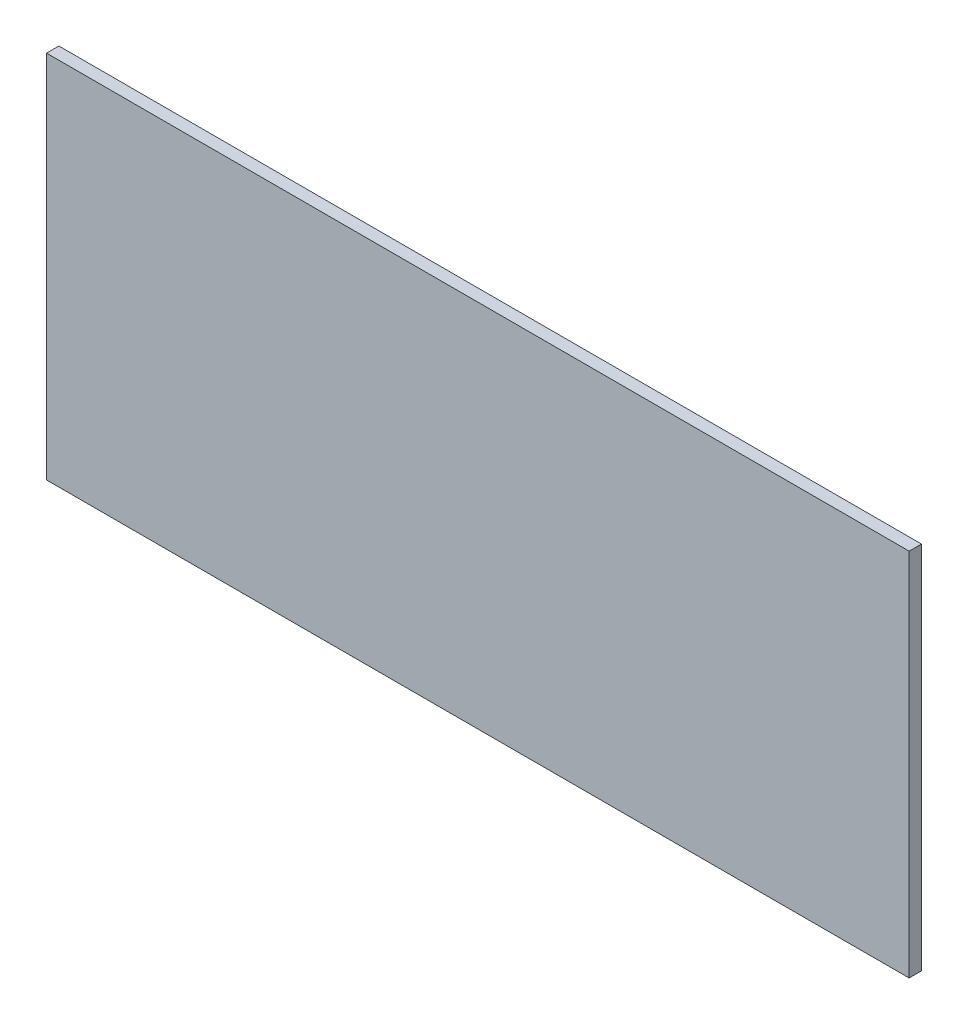
ISO-10303-21;
HEADER;
FILE_DESCRIPTION(('STEP AP214'),'2;1');
FILE_NAME('part.step','',(''),(''),'','','');
FILE_SCHEMA(('AUTOMOTIVE_DESIGN { 1 0 10303 214 1 1 1 1 }'));
ENDSEC;
DATA;
#1=APPLICATION_CONTEXT('core data for automotive mechanical design processes');
#2=APPLICATION_PROTOCOL_DEFINITION('international standard','automotive_design',2000,#1);
#3=PRODUCT_CONTEXT('',#1,'mechanical');
#4=PRODUCT('Part','Part','',(#3));
#5=PRODUCT_RELATED_PRODUCT_CATEGORY('part','',(#4));
#6=PRODUCT_DEFINITION_FORMATION('','',#4);
#7=PRODUCT_DEFINITION_CONTEXT('part definition',#1,'design');
#8=PRODUCT_DEFINITION('design','',#6,#7);
#9=PRODUCT_DEFINITION_SHAPE('','',#8);
#10=(LENGTH_UNIT() NAMED_UNIT(*) SI_UNIT(.MILLI.,.METRE.));
#11=(NAMED_UNIT(*) PLANE_ANGLE_UNIT() SI_UNIT($,.RADIAN.));
#12=(NAMED_UNIT(*) SI_UNIT($,.STERADIAN.) SOLID_ANGLE_UNIT());
#13=UNCERTAINTY_MEASURE_WITH_UNIT(LENGTH_MEASURE(1.E-05),#10,'distance_accuracy_value','');
#14=(GEOMETRIC_REPRESENTATION_CONTEXT(3) GLOBAL_UNCERTAINTY_ASSIGNED_CONTEXT((#13)) GLOBAL_UNIT_ASSIGNED_CONTEXT((#10,
#11,#12)) REPRESENTATION_CONTEXT('',''));
#15=CARTESIAN_POINT('',(0.,0.,0.));
#16=DIRECTION('',(0.,0.,1.));
#17=DIRECTION('',(1.,0.,0.));
#18=AXIS2_PLACEMENT_3D('',#15,#16,#17);
#19=CARTESIAN_POINT('',(-89.1028945623643,11.4121558903935,-2.54));
#20=DIRECTION('',(-1.,0.,0.));
#21=DIRECTION('',(0.,0.,1.));
#22=AXIS2_PLACEMENT_3D('',#19,#20,#21);
#23=PLANE('',#22);
#24=DIRECTION('',(0.,-1.,0.));
#25=VECTOR('',#24,1.);
#26=CARTESIAN_POINT('',(-89.1028945623643,11.4121558903935,0.));
#27=LINE('',#26,#25);
#28=CARTESIAN_POINT('',(-89.1028945623643,11.4121558903935,0.));
#29=VERTEX_POINT('',#28);
#30=CARTESIAN_POINT('',(-89.1028945623643,-64.7878441096065,0.));
#31=VERTEX_POINT('',#30);
#32=EDGE_CURVE('E97',#29,#31,#27,.T.);
#33=ORIENTED_EDGE('',*,*,#32,.F.);
#34=DIRECTION('',(0.,0.,1.));
#35=VECTOR('',#34,1.);
#36=CARTESIAN_POINT('',(-89.1028945623643,11.4121558903935,-2.54));
#37=LINE('',#36,#35);
#38=CARTESIAN_POINT('',(-89.1028945623643,11.4121558903935,-2.54));
#39=VERTEX_POINT('',#38);
#40=EDGE_CURVE('E11',#39,#29,#37,.T.);
#41=ORIENTED_EDGE('',*,*,#40,.F.);
#42=DIRECTION('',(0.,-1.,0.));
#43=VECTOR('',#42,1.);
#44=CARTESIAN_POINT('',(-89.1028945623643,11.4121558903935,-2.54));
#45=LINE('',#44,#43);
#46=CARTESIAN_POINT('',(-89.1028945623643,-64.7878441096065,-2.54));
#47=VERTEX_POINT('',#46);
#48=EDGE_CURVE('E91',#39,#47,#45,.T.);
#49=ORIENTED_EDGE('',*,*,#48,.T.);
#50=DIRECTION('',(0.,0.,1.));
#51=VECTOR('',#50,1.);
#52=CARTESIAN_POINT('',(-89.1028945623643,-64.7878441096065,-2.54));
#53=LINE('',#52,#51);
#54=EDGE_CURVE('E36',#47,#31,#53,.T.);
#55=ORIENTED_EDGE('',*,*,#54,.T.);
#56=EDGE_LOOP('',(#33,#41,#49,#55));
#57=FACE_BOUND('',#56,.T.);
#58=ADVANCED_FACE('F33',(#57),#23,.T.);
#59=CARTESIAN_POINT('',(-89.1028945623643,11.4121558903935,-2.54));
#60=DIRECTION('',(0.,1.,0.));
#61=DIRECTION('',(0.,0.,1.));
#62=AXIS2_PLACEMENT_3D('',#59,#60,#61);
#63=PLANE('',#62);
#64=DIRECTION('',(-1.,0.,0.));
#65=VECTOR('',#64,1.);
#66=CARTESIAN_POINT('',(-89.1028945623643,11.4121558903935,0.));
#67=LINE('',#66,#65);
#68=CARTESIAN_POINT('',(88.6971054376357,11.4121558903935,0.));
#69=VERTEX_POINT('',#68);
#70=EDGE_CURVE('E93',#69,#29,#67,.T.);
#71=ORIENTED_EDGE('',*,*,#70,.F.);
#72=DIRECTION('',(0.,0.,1.));
#73=VECTOR('',#72,1.);
#74=CARTESIAN_POINT('',(88.6971054376357,11.4121558903935,-2.54));
#75=LINE('',#74,#73);
#76=CARTESIAN_POINT('',(88.6971054376357,11.4121558903935,-2.54));
#77=VERTEX_POINT('',#76);
#78=EDGE_CURVE('E42',#77,#69,#75,.T.);
#79=ORIENTED_EDGE('',*,*,#78,.F.);
#80=DIRECTION('',(-1.,0.,0.));
#81=VECTOR('',#80,1.);
#82=CARTESIAN_POINT('',(-89.1028945623643,11.4121558903935,-2.54));
#83=LINE('',#82,#81);
#84=EDGE_CURVE('E88',#77,#39,#83,.T.);
#85=ORIENTED_EDGE('',*,*,#84,.T.);
#86=ORIENTED_EDGE('',*,*,#40,.T.);
#87=EDGE_LOOP('',(#71,#79,#85,#86));
#88=FACE_BOUND('',#87,.T.);
#89=ADVANCED_FACE('F107',(#88),#63,.T.);
#90=CARTESIAN_POINT('',(88.6971054376357,11.4121558903935,-2.54));
#91=DIRECTION('',(1.,0.,0.));
#92=DIRECTION('',(0.,0.,-1.));
#93=AXIS2_PLACEMENT_3D('',#90,#91,#92);
#94=PLANE('',#93);
#95=DIRECTION('',(0.,1.,0.));
#96=VECTOR('',#95,1.);
#97=CARTESIAN_POINT('',(88.6971054376357,11.4121558903935,0.));
#98=LINE('',#97,#96);
#99=CARTESIAN_POINT('',(88.6971054376357,-64.7878441096065,0.));
#100=VERTEX_POINT('',#99);
#101=EDGE_CURVE('E83',#100,#69,#98,.T.);
#102=ORIENTED_EDGE('',*,*,#101,.F.);
#103=DIRECTION('',(0.,0.,1.));
#104=VECTOR('',#103,1.);
#105=CARTESIAN_POINT('',(88.6971054376357,-64.7878441096065,-2.54));
#106=LINE('',#105,#104);
#107=CARTESIAN_POINT('',(88.6971054376357,-64.7878441096065,-2.54));
#108=VERTEX_POINT('',#107);
#109=EDGE_CURVE('E78',#108,#100,#106,.T.);
#110=ORIENTED_EDGE('',*,*,#109,.F.);
#111=DIRECTION('',(0.,1.,0.));
#112=VECTOR('',#111,1.);
#113=CARTESIAN_POINT('',(88.6971054376357,11.4121558903935,-2.54));
#114=LINE('',#113,#112);
#115=EDGE_CURVE('E81',#108,#77,#114,.T.);
#116=ORIENTED_EDGE('',*,*,#115,.T.);
#117=ORIENTED_EDGE('',*,*,#78,.T.);
#118=EDGE_LOOP('',(#102,#110,#116,#117));
#119=FACE_BOUND('',#118,.T.);
#120=ADVANCED_FACE('F80',(#119),#94,.T.);
#121=CARTESIAN_POINT('',(-89.1028945623643,-64.7878441096065,-2.54));
#122=DIRECTION('',(0.,-1.,0.));
#123=DIRECTION('',(0.,0.,-1.));
#124=AXIS2_PLACEMENT_3D('',#121,#122,#123);
#125=PLANE('',#124);
#126=DIRECTION('',(1.,0.,0.));
#127=VECTOR('',#126,1.);
#128=CARTESIAN_POINT('',(-89.1028945623643,-64.7878441096065,0.));
#129=LINE('',#128,#127);
#130=EDGE_CURVE('E100',#31,#100,#129,.T.);
#131=ORIENTED_EDGE('',*,*,#130,.F.);
#132=ORIENTED_EDGE('',*,*,#54,.F.);
#133=DIRECTION('',(1.,0.,0.));
#134=VECTOR('',#133,1.);
#135=CARTESIAN_POINT('',(-89.1028945623643,-64.7878441096065,-2.54));
#136=LINE('',#135,#134);
#137=EDGE_CURVE('E87',#47,#108,#136,.T.);
#138=ORIENTED_EDGE('',*,*,#137,.T.);
#139=ORIENTED_EDGE('',*,*,#109,.T.);
#140=EDGE_LOOP('',(#131,#132,#138,#139));
#141=FACE_BOUND('',#140,.T.);
#142=ADVANCED_FACE('F90',(#141),#125,.T.);
#143=CARTESIAN_POINT('',(0.,0.,-2.54));
#144=DIRECTION('',(0.,0.,1.));
#145=DIRECTION('',(1.,0.,0.));
#146=AXIS2_PLACEMENT_3D('',#143,#144,#145);
#147=PLANE('',#146);
#148=ORIENTED_EDGE('',*,*,#48,.F.);
#149=ORIENTED_EDGE('',*,*,#84,.F.);
#150=ORIENTED_EDGE('',*,*,#115,.F.);
#151=ORIENTED_EDGE('',*,*,#137,.F.);
#152=EDGE_LOOP('',(#148,#149,#150,#151));
#153=FACE_BOUND('',#152,.T.);
#154=ADVANCED_FACE('F86',(#153),#147,.F.);
#155=CARTESIAN_POINT('',(0.,0.,0.));
#156=DIRECTION('',(0.,0.,1.));
#157=DIRECTION('',(1.,0.,0.));
#158=AXIS2_PLACEMENT_3D('',#155,#156,#157);
#159=PLANE('',#158);
#160=ORIENTED_EDGE('',*,*,#32,.T.);
#161=ORIENTED_EDGE('',*,*,#130,.T.);
#162=ORIENTED_EDGE('',*,*,#101,.T.);
#163=ORIENTED_EDGE('',*,*,#70,.T.);
#164=EDGE_LOOP('',(#160,#161,#162,#163));
#165=FACE_BOUND('',#164,.T.);
#166=ADVANCED_FACE('F106',(#165),#159,.T.);
#167=CLOSED_SHELL('',(#58,#89,#120,#142,#154,#166));
#168=MANIFOLD_SOLID_BREP('B2',#167);
#169=ADVANCED_BREP_SHAPE_REPRESENTATION('',(#18,#168),#14);
#170=SHAPE_DEFINITION_REPRESENTATION(#9,#169);
ENDSEC;
END-ISO-10303-21;
